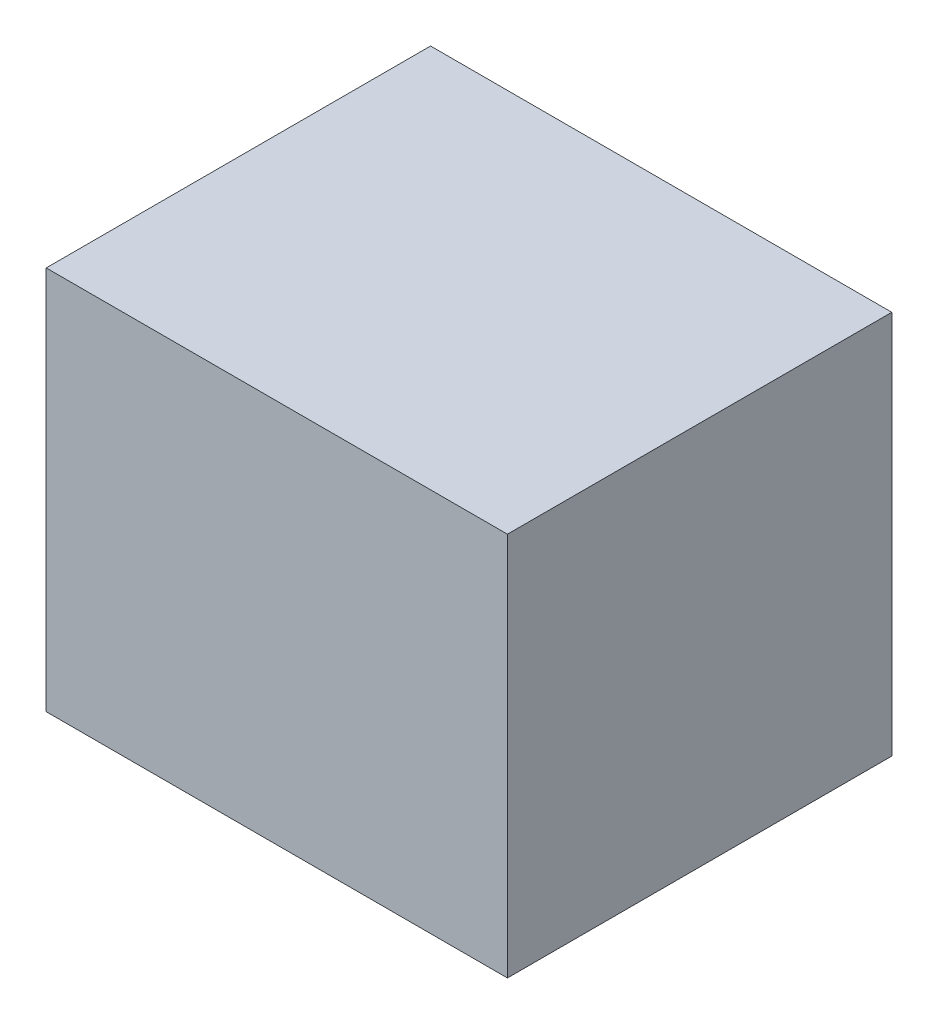
ISO-10303-21;
HEADER;
FILE_DESCRIPTION(('STEP AP214'),'2;1');
FILE_NAME('part.step','',(''),(''),'','','');
FILE_SCHEMA(('AUTOMOTIVE_DESIGN { 1 0 10303 214 1 1 1 1 }'));
ENDSEC;
DATA;
#1=APPLICATION_CONTEXT('core data for automotive mechanical design processes');
#2=APPLICATION_PROTOCOL_DEFINITION('international standard','automotive_design',2000,#1);
#3=PRODUCT_CONTEXT('',#1,'mechanical');
#4=PRODUCT('Part','Part','',(#3));
#5=PRODUCT_RELATED_PRODUCT_CATEGORY('part','',(#4));
#6=PRODUCT_DEFINITION_FORMATION('','',#4);
#7=PRODUCT_DEFINITION_CONTEXT('part definition',#1,'design');
#8=PRODUCT_DEFINITION('design','',#6,#7);
#9=PRODUCT_DEFINITION_SHAPE('','',#8);
#10=(LENGTH_UNIT() NAMED_UNIT(*) SI_UNIT(.MILLI.,.METRE.));
#11=(NAMED_UNIT(*) PLANE_ANGLE_UNIT() SI_UNIT($,.RADIAN.));
#12=(NAMED_UNIT(*) SI_UNIT($,.STERADIAN.) SOLID_ANGLE_UNIT());
#13=UNCERTAINTY_MEASURE_WITH_UNIT(LENGTH_MEASURE(1.E-05),#10,'distance_accuracy_value','');
#14=(GEOMETRIC_REPRESENTATION_CONTEXT(3) GLOBAL_UNCERTAINTY_ASSIGNED_CONTEXT((#13)) GLOBAL_UNIT_ASSIGNED_CONTEXT((#10,
#11,#12)) REPRESENTATION_CONTEXT('',''));
#15=CARTESIAN_POINT('',(0.,0.,0.));
#16=DIRECTION('',(0.,0.,1.));
#17=DIRECTION('',(1.,0.,0.));
#18=AXIS2_PLACEMENT_3D('',#15,#16,#17);
#19=CARTESIAN_POINT('',(25.095765455067,-15.40919741325,-12.69303980818));
#20=DIRECTION('',(0.,-1.,0.));
#21=DIRECTION('',(0.,0.,-1.));
#22=AXIS2_PLACEMENT_3D('',#19,#20,#21);
#23=PLANE('',#22);
#24=DIRECTION('',(0.,0.,-1.));
#25=VECTOR('',#24,1.);
#26=CARTESIAN_POINT('',(24.495765455067,-15.40919741325,-12.69303980818));
#27=LINE('',#26,#25);
#28=CARTESIAN_POINT('',(24.495765455067,-15.40919741325,-13.19303980818));
#29=VERTEX_POINT('',#28);
#30=CARTESIAN_POINT('',(24.495765455067,-15.40919741325,-12.69303980818));
#31=VERTEX_POINT('',#30);
#32=EDGE_CURVE('E20',#29,#31,#27,.F.);
#33=ORIENTED_EDGE('',*,*,#32,.T.);
#34=DIRECTION('',(1.,0.,0.));
#35=VECTOR('',#34,1.);
#36=CARTESIAN_POINT('',(24.495765455067,-15.40919741325,-12.69303980818));
#37=LINE('',#36,#35);
#38=CARTESIAN_POINT('',(25.095765455067,-15.40919741325,-12.69303980818));
#39=VERTEX_POINT('',#38);
#40=EDGE_CURVE('E55',#39,#31,#37,.F.);
#41=ORIENTED_EDGE('',*,*,#40,.F.);
#42=DIRECTION('',(0.,0.,1.));
#43=VECTOR('',#42,1.);
#44=CARTESIAN_POINT('',(25.095765455067,-15.40919741325,-12.69303980818));
#45=LINE('',#44,#43);
#46=CARTESIAN_POINT('',(25.095765455067,-15.40919741325,-13.19303980818));
#47=VERTEX_POINT('',#46);
#48=EDGE_CURVE('E76',#39,#47,#45,.F.);
#49=ORIENTED_EDGE('',*,*,#48,.T.);
#50=DIRECTION('',(1.,0.,0.));
#51=VECTOR('',#50,1.);
#52=CARTESIAN_POINT('',(24.495765455067,-15.40919741325,-13.19303980818));
#53=LINE('',#52,#51);
#54=EDGE_CURVE('E58',#47,#29,#53,.F.);
#55=ORIENTED_EDGE('',*,*,#54,.T.);
#56=EDGE_LOOP('',(#33,#41,#49,#55));
#57=FACE_BOUND('',#56,.T.);
#58=ADVANCED_FACE('F17',(#57),#23,.F.);
#59=CARTESIAN_POINT('',(24.495765455067,-15.40919741325,-12.69303980818));
#60=DIRECTION('',(1.,0.,0.));
#61=DIRECTION('',(0.,0.,-1.));
#62=AXIS2_PLACEMENT_3D('',#59,#60,#61);
#63=PLANE('',#62);
#64=DIRECTION('',(0.,0.,1.));
#65=VECTOR('',#64,1.);
#66=CARTESIAN_POINT('',(24.495765455067,-15.90919741325,-12.69303980818));
#67=LINE('',#66,#65);
#68=CARTESIAN_POINT('',(24.495765455067,-15.90919741325,-13.19303980818));
#69=VERTEX_POINT('',#68);
#70=CARTESIAN_POINT('',(24.495765455067,-15.90919741325,-12.69303980818));
#71=VERTEX_POINT('',#70);
#72=EDGE_CURVE('E73',#69,#71,#67,.T.);
#73=ORIENTED_EDGE('',*,*,#72,.T.);
#74=DIRECTION('',(0.,1.,0.));
#75=VECTOR('',#74,1.);
#76=CARTESIAN_POINT('',(24.495765455067,-15.90919741325,-12.69303980818));
#77=LINE('',#76,#75);
#78=EDGE_CURVE('E63',#31,#71,#77,.F.);
#79=ORIENTED_EDGE('',*,*,#78,.F.);
#80=ORIENTED_EDGE('',*,*,#32,.F.);
#81=DIRECTION('',(0.,1.,0.));
#82=VECTOR('',#81,1.);
#83=CARTESIAN_POINT('',(24.495765455067,-15.90919741325,-13.19303980818));
#84=LINE('',#83,#82);
#85=EDGE_CURVE('E80',#29,#69,#84,.F.);
#86=ORIENTED_EDGE('',*,*,#85,.T.);
#87=EDGE_LOOP('',(#73,#79,#80,#86));
#88=FACE_BOUND('',#87,.T.);
#89=ADVANCED_FACE('F72',(#88),#63,.F.);
#90=CARTESIAN_POINT('',(24.495765455067,-15.90919741325,-12.69303980818));
#91=DIRECTION('',(0.,0.,1.));
#92=DIRECTION('',(1.,0.,0.));
#93=AXIS2_PLACEMENT_3D('',#90,#91,#92);
#94=PLANE('',#93);
#95=DIRECTION('',(0.,1.,0.));
#96=VECTOR('',#95,1.);
#97=CARTESIAN_POINT('',(25.095765455067,-15.90919741325,-12.69303980818));
#98=LINE('',#97,#96);
#99=CARTESIAN_POINT('',(25.095765455067,-15.90919741325,-12.69303980818));
#100=VERTEX_POINT('',#99);
#101=EDGE_CURVE('E69',#100,#39,#98,.T.);
#102=ORIENTED_EDGE('',*,*,#101,.T.);
#103=ORIENTED_EDGE('',*,*,#40,.T.);
#104=ORIENTED_EDGE('',*,*,#78,.T.);
#105=DIRECTION('',(1.,0.,0.));
#106=VECTOR('',#105,1.);
#107=CARTESIAN_POINT('',(24.495765455067,-15.90919741325,-12.69303980818));
#108=LINE('',#107,#106);
#109=EDGE_CURVE('E83',#71,#100,#108,.T.);
#110=ORIENTED_EDGE('',*,*,#109,.T.);
#111=EDGE_LOOP('',(#102,#103,#104,#110));
#112=FACE_BOUND('',#111,.T.);
#113=ADVANCED_FACE('F66',(#112),#94,.T.);
#114=CARTESIAN_POINT('',(25.095765455067,-15.90919741325,-12.69303980818));
#115=DIRECTION('',(-1.,0.,0.));
#116=DIRECTION('',(0.,0.,1.));
#117=AXIS2_PLACEMENT_3D('',#114,#115,#116);
#118=PLANE('',#117);
#119=ORIENTED_EDGE('',*,*,#48,.F.);
#120=ORIENTED_EDGE('',*,*,#101,.F.);
#121=DIRECTION('',(0.,0.,1.));
#122=VECTOR('',#121,1.);
#123=CARTESIAN_POINT('',(25.095765455067,-15.90919741325,-12.69303980818));
#124=LINE('',#123,#122);
#125=CARTESIAN_POINT('',(25.095765455067,-15.90919741325,-13.19303980818));
#126=VERTEX_POINT('',#125);
#127=EDGE_CURVE('E26',#100,#126,#124,.F.);
#128=ORIENTED_EDGE('',*,*,#127,.T.);
#129=DIRECTION('',(0.,1.,0.));
#130=VECTOR('',#129,1.);
#131=CARTESIAN_POINT('',(25.095765455067,-15.90919741325,-13.19303980818));
#132=LINE('',#131,#130);
#133=EDGE_CURVE('E34',#126,#47,#132,.T.);
#134=ORIENTED_EDGE('',*,*,#133,.T.);
#135=EDGE_LOOP('',(#119,#120,#128,#134));
#136=FACE_BOUND('',#135,.T.);
#137=ADVANCED_FACE('F88',(#136),#118,.F.);
#138=CARTESIAN_POINT('',(24.495765455067,-15.90919741325,-13.19303980818));
#139=DIRECTION('',(0.,0.,1.));
#140=DIRECTION('',(1.,0.,0.));
#141=AXIS2_PLACEMENT_3D('',#138,#139,#140);
#142=PLANE('',#141);
#143=ORIENTED_EDGE('',*,*,#54,.F.);
#144=ORIENTED_EDGE('',*,*,#133,.F.);
#145=DIRECTION('',(1.,0.,0.));
#146=VECTOR('',#145,1.);
#147=CARTESIAN_POINT('',(24.495765455067,-15.90919741325,-13.19303980818));
#148=LINE('',#147,#146);
#149=EDGE_CURVE('E11',#126,#69,#148,.F.);
#150=ORIENTED_EDGE('',*,*,#149,.T.);
#151=ORIENTED_EDGE('',*,*,#85,.F.);
#152=EDGE_LOOP('',(#143,#144,#150,#151));
#153=FACE_BOUND('',#152,.T.);
#154=ADVANCED_FACE('F91',(#153),#142,.F.);
#155=CARTESIAN_POINT('',(24.495765455067,-15.90919741325,-12.69303980818));
#156=DIRECTION('',(0.,1.,0.));
#157=DIRECTION('',(0.,0.,1.));
#158=AXIS2_PLACEMENT_3D('',#155,#156,#157);
#159=PLANE('',#158);
#160=ORIENTED_EDGE('',*,*,#127,.F.);
#161=ORIENTED_EDGE('',*,*,#109,.F.);
#162=ORIENTED_EDGE('',*,*,#72,.F.);
#163=ORIENTED_EDGE('',*,*,#149,.F.);
#164=EDGE_LOOP('',(#160,#161,#162,#163));
#165=FACE_BOUND('',#164,.T.);
#166=ADVANCED_FACE('F90',(#165),#159,.F.);
#167=CLOSED_SHELL('',(#58,#89,#113,#137,#154,#166));
#168=MANIFOLD_SOLID_BREP('B1',#167);
#169=ADVANCED_BREP_SHAPE_REPRESENTATION('',(#18,#168),#14);
#170=SHAPE_DEFINITION_REPRESENTATION(#9,#169);
ENDSEC;
END-ISO-10303-21;
